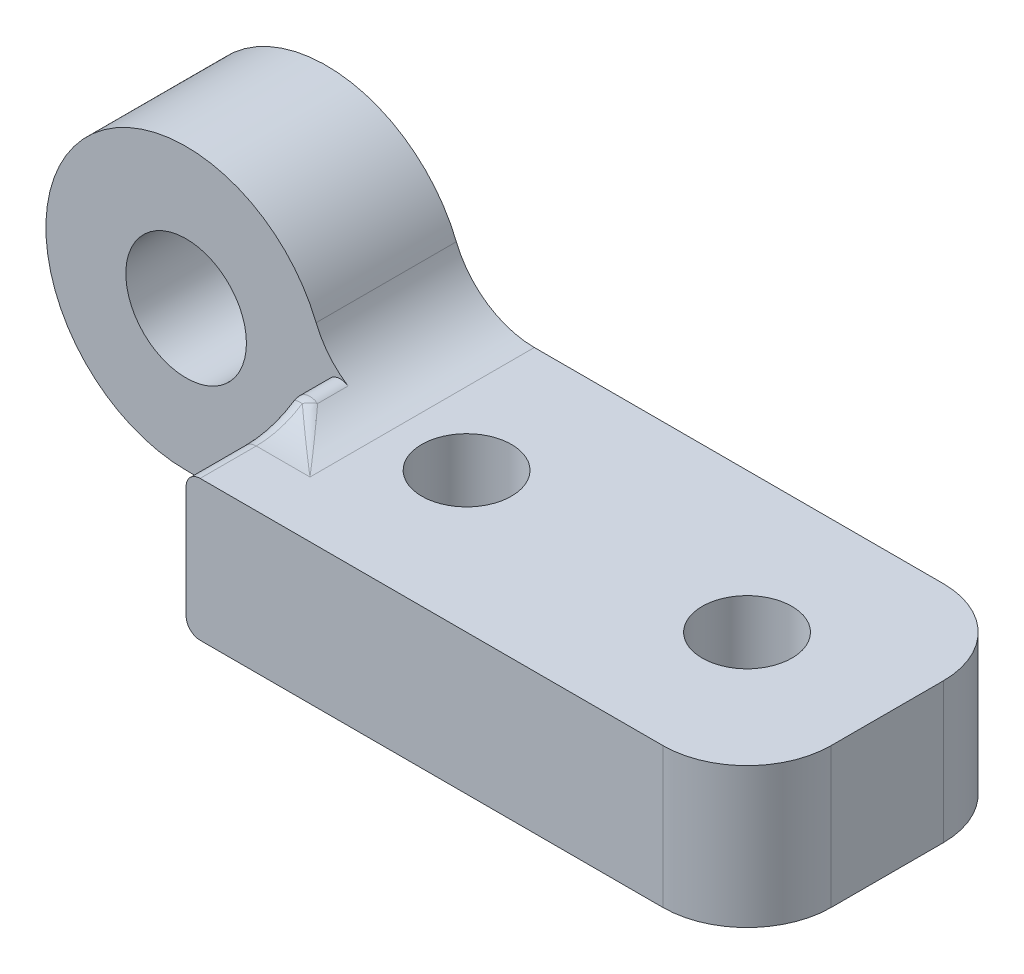
ISO-10303-21;
HEADER;
FILE_DESCRIPTION(('STEP AP214'),'2;1');
FILE_NAME('part.step','',(''),(''),'','','');
FILE_SCHEMA(('AUTOMOTIVE_DESIGN { 1 0 10303 214 1 1 1 1 }'));
ENDSEC;
DATA;
#1=APPLICATION_CONTEXT('core data for automotive mechanical design processes');
#2=APPLICATION_PROTOCOL_DEFINITION('international standard','automotive_design',2000,#1);
#3=PRODUCT_CONTEXT('',#1,'mechanical');
#4=PRODUCT('Part','Part','',(#3));
#5=PRODUCT_RELATED_PRODUCT_CATEGORY('part','',(#4));
#6=PRODUCT_DEFINITION_FORMATION('','',#4);
#7=PRODUCT_DEFINITION_CONTEXT('part definition',#1,'design');
#8=PRODUCT_DEFINITION('design','',#6,#7);
#9=PRODUCT_DEFINITION_SHAPE('','',#8);
#10=(LENGTH_UNIT() NAMED_UNIT(*) SI_UNIT(.MILLI.,.METRE.));
#11=(NAMED_UNIT(*) PLANE_ANGLE_UNIT() SI_UNIT($,.RADIAN.));
#12=(NAMED_UNIT(*) SI_UNIT($,.STERADIAN.) SOLID_ANGLE_UNIT());
#13=UNCERTAINTY_MEASURE_WITH_UNIT(LENGTH_MEASURE(1.E-05),#10,'distance_accuracy_value','');
#14=(GEOMETRIC_REPRESENTATION_CONTEXT(3) GLOBAL_UNCERTAINTY_ASSIGNED_CONTEXT((#13)) GLOBAL_UNIT_ASSIGNED_CONTEXT((#10,
#11,#12)) REPRESENTATION_CONTEXT('',''));
#15=CARTESIAN_POINT('',(0.,0.,0.));
#16=DIRECTION('',(0.,0.,1.));
#17=DIRECTION('',(1.,0.,0.));
#18=AXIS2_PLACEMENT_3D('',#15,#16,#17);
#19=CARTESIAN_POINT('',(0.,0.,-5.));
#20=DIRECTION('',(0.,0.,1.));
#21=DIRECTION('',(1.,0.,0.));
#22=AXIS2_PLACEMENT_3D('',#19,#20,#21);
#23=PLANE('',#22);
#24=CARTESIAN_POINT('',(0.,0.,-5.));
#25=DIRECTION('',(0.,0.,1.));
#26=DIRECTION('',(1.,0.,0.));
#27=AXIS2_PLACEMENT_3D('',#24,#25,#26);
#28=CIRCLE('',#27,2.15);
#29=CARTESIAN_POINT('',(2.15,0.,-5.));
#30=VERTEX_POINT('',#29);
#31=EDGE_CURVE('E157',#30,#30,#28,.T.);
#32=ORIENTED_EDGE('',*,*,#31,.F.);
#33=EDGE_LOOP('',(#32));
#34=FACE_BOUND('',#33,.T.);
#35=DIRECTION('',(0.,-1.,0.));
#36=VECTOR('',#35,1.);
#37=CARTESIAN_POINT('',(5.,0.,-5.));
#38=LINE('',#37,#36);
#39=CARTESIAN_POINT('',(5.,0.0711464089080361,-5.));
#40=VERTEX_POINT('',#39);
#41=CARTESIAN_POINT('',(5.,-4.5,-5.));
#42=VERTEX_POINT('',#41);
#43=EDGE_CURVE('E181',#40,#42,#38,.T.);
#44=ORIENTED_EDGE('',*,*,#43,.F.);
#45=CARTESIAN_POINT('',(5.5,0.0711464089080361,-5.));
#46=DIRECTION('',(0.,0.,1.));
#47=DIRECTION('',(1.,0.,0.));
#48=AXIS2_PLACEMENT_3D('',#45,#46,#47);
#49=CIRCLE('',#48,0.5);
#50=CARTESIAN_POINT('',(5.77374264101367,0.489554064778317,-5.));
#51=VERTEX_POINT('',#50);
#52=EDGE_CURVE('E234',#40,#51,#49,.F.);
#53=ORIENTED_EDGE('',*,*,#52,.T.);
#54=CARTESIAN_POINT('',(7.41619848709566,3.,-5.));
#55=DIRECTION('',(0.,0.,1.));
#56=DIRECTION('',(1.,0.,0.));
#57=AXIS2_PLACEMENT_3D('',#54,#55,#56);
#58=CIRCLE('',#57,3.);
#59=CARTESIAN_POINT('',(4.63512405443479,1.875,-5.));
#60=VERTEX_POINT('',#59);
#61=EDGE_CURVE('E207',#51,#60,#58,.F.);
#62=ORIENTED_EDGE('',*,*,#61,.T.);
#63=CARTESIAN_POINT('',(0.,0.,-5.));
#64=DIRECTION('',(0.,0.,1.));
#65=DIRECTION('',(1.,0.,0.));
#66=AXIS2_PLACEMENT_3D('',#63,#64,#65);
#67=CIRCLE('',#66,5.);
#68=CARTESIAN_POINT('',(0.,-5.,-5.));
#69=VERTEX_POINT('',#68);
#70=EDGE_CURVE('E156',#60,#69,#67,.T.);
#71=ORIENTED_EDGE('',*,*,#70,.T.);
#72=DIRECTION('',(-1.,0.,0.));
#73=VECTOR('',#72,1.);
#74=CARTESIAN_POINT('',(0.,-5.,-5.));
#75=LINE('',#74,#73);
#76=CARTESIAN_POINT('',(5.5,-5.,-5.));
#77=VERTEX_POINT('',#76);
#78=EDGE_CURVE('E173',#77,#69,#75,.T.);
#79=ORIENTED_EDGE('',*,*,#78,.F.);
#80=CARTESIAN_POINT('',(5.5,-4.5,-5.));
#81=DIRECTION('',(0.,0.,1.));
#82=DIRECTION('',(1.,0.,0.));
#83=AXIS2_PLACEMENT_3D('',#80,#81,#82);
#84=CIRCLE('',#83,0.5);
#85=EDGE_CURVE('E231',#77,#42,#84,.F.);
#86=ORIENTED_EDGE('',*,*,#85,.T.);
#87=EDGE_LOOP('',(#44,#53,#62,#71,#79,#86));
#88=FACE_BOUND('',#87,.T.);
#89=ADVANCED_FACE('F43',(#34,#88),#23,.T.);
#90=CARTESIAN_POINT('',(0.,0.,-10.));
#91=DIRECTION('',(0.,0.,1.));
#92=DIRECTION('',(1.,0.,0.));
#93=AXIS2_PLACEMENT_3D('',#90,#91,#92);
#94=PLANE('',#93);
#95=DIRECTION('',(1.,0.,0.));
#96=VECTOR('',#95,1.);
#97=CARTESIAN_POINT('',(0.,0.,-10.));
#98=LINE('',#97,#96);
#99=CARTESIAN_POINT('',(7.41619848709566,0.,-10.));
#100=VERTEX_POINT('',#99);
#101=CARTESIAN_POINT('',(22.,0.,-10.));
#102=VERTEX_POINT('',#101);
#103=EDGE_CURVE('E186',#100,#102,#98,.T.);
#104=ORIENTED_EDGE('',*,*,#103,.T.);
#105=DIRECTION('',(0.,-1.,0.));
#106=VECTOR('',#105,1.);
#107=CARTESIAN_POINT('',(22.,0.,-10.));
#108=LINE('',#107,#106);
#109=CARTESIAN_POINT('',(22.,-5.,-10.));
#110=VERTEX_POINT('',#109);
#111=EDGE_CURVE('E166',#102,#110,#108,.T.);
#112=ORIENTED_EDGE('',*,*,#111,.T.);
#113=DIRECTION('',(1.,0.,0.));
#114=VECTOR('',#113,1.);
#115=CARTESIAN_POINT('',(0.,-5.,-10.));
#116=LINE('',#115,#114);
#117=CARTESIAN_POINT('',(0.,-5.,-10.));
#118=VERTEX_POINT('',#117);
#119=EDGE_CURVE('E161',#118,#110,#116,.T.);
#120=ORIENTED_EDGE('',*,*,#119,.F.);
#121=CARTESIAN_POINT('',(0.,0.,-10.));
#122=DIRECTION('',(0.,0.,1.));
#123=DIRECTION('',(1.,0.,0.));
#124=AXIS2_PLACEMENT_3D('',#121,#122,#123);
#125=CIRCLE('',#124,5.);
#126=CARTESIAN_POINT('',(4.63512405443479,1.875,-10.));
#127=VERTEX_POINT('',#126);
#128=EDGE_CURVE('E145',#127,#118,#125,.T.);
#129=ORIENTED_EDGE('',*,*,#128,.F.);
#130=CARTESIAN_POINT('',(7.41619848709566,3.,-10.));
#131=DIRECTION('',(0.,0.,1.));
#132=DIRECTION('',(1.,0.,0.));
#133=AXIS2_PLACEMENT_3D('',#130,#131,#132);
#134=CIRCLE('',#133,3.);
#135=EDGE_CURVE('E204',#127,#100,#134,.T.);
#136=ORIENTED_EDGE('',*,*,#135,.T.);
#137=EDGE_LOOP('',(#104,#112,#120,#129,#136));
#138=FACE_BOUND('',#137,.T.);
#139=CARTESIAN_POINT('',(0.,0.,-10.));
#140=DIRECTION('',(0.,0.,1.));
#141=DIRECTION('',(1.,0.,0.));
#142=AXIS2_PLACEMENT_3D('',#139,#140,#141);
#143=CIRCLE('',#142,2.15);
#144=CARTESIAN_POINT('',(2.15,0.,-10.));
#145=VERTEX_POINT('',#144);
#146=EDGE_CURVE('E189',#145,#145,#143,.T.);
#147=ORIENTED_EDGE('',*,*,#146,.T.);
#148=EDGE_LOOP('',(#147));
#149=FACE_BOUND('',#148,.T.);
#150=ADVANCED_FACE('F163',(#138,#149),#94,.F.);
#151=CARTESIAN_POINT('',(0.,0.,-5.));
#152=DIRECTION('',(0.,0.,-1.));
#153=DIRECTION('',(-1.,0.,0.));
#154=AXIS2_PLACEMENT_3D('',#151,#152,#153);
#155=CYLINDRICAL_SURFACE('',#154,5.);
#156=ORIENTED_EDGE('',*,*,#70,.F.);
#157=DIRECTION('',(0.,0.,-1.));
#158=VECTOR('',#157,1.);
#159=CARTESIAN_POINT('',(4.63512405443479,1.875,-5.));
#160=LINE('',#159,#158);
#161=EDGE_CURVE('E153',#60,#127,#160,.T.);
#162=ORIENTED_EDGE('',*,*,#161,.T.);
#163=ORIENTED_EDGE('',*,*,#128,.T.);
#164=DIRECTION('',(0.,0.,-1.));
#165=VECTOR('',#164,1.);
#166=CARTESIAN_POINT('',(0.,-5.,0.));
#167=LINE('',#166,#165);
#168=EDGE_CURVE('E150',#69,#118,#167,.T.);
#169=ORIENTED_EDGE('',*,*,#168,.F.);
#170=EDGE_LOOP('',(#156,#162,#163,#169));
#171=FACE_BOUND('',#170,.T.);
#172=ADVANCED_FACE('F148',(#171),#155,.T.);
#173=CARTESIAN_POINT('',(0.,0.,-5.));
#174=DIRECTION('',(0.,0.,-1.));
#175=DIRECTION('',(-1.,0.,0.));
#176=AXIS2_PLACEMENT_3D('',#173,#174,#175);
#177=CYLINDRICAL_SURFACE('',#176,2.15);
#178=ORIENTED_EDGE('',*,*,#146,.F.);
#179=EDGE_LOOP('',(#178));
#180=FACE_BOUND('',#179,.T.);
#181=ORIENTED_EDGE('',*,*,#31,.T.);
#182=EDGE_LOOP('',(#181));
#183=FACE_BOUND('',#182,.T.);
#184=ADVANCED_FACE('F312',(#180,#183),#177,.F.);
#185=CARTESIAN_POINT('',(0.,0.,0.));
#186=DIRECTION('',(0.,1.,0.));
#187=DIRECTION('',(0.,0.,1.));
#188=AXIS2_PLACEMENT_3D('',#185,#186,#187);
#189=PLANE('',#188);
#190=CARTESIAN_POINT('',(20.,0.,-5.));
#191=DIRECTION('',(0.,1.,0.));
#192=DIRECTION('',(0.,0.,1.));
#193=AXIS2_PLACEMENT_3D('',#190,#191,#192);
#194=CIRCLE('',#193,1.6);
#195=CARTESIAN_POINT('',(20.,0.,-3.4));
#196=VERTEX_POINT('',#195);
#197=EDGE_CURVE('E177',#196,#196,#194,.T.);
#198=ORIENTED_EDGE('',*,*,#197,.F.);
#199=EDGE_LOOP('',(#198));
#200=FACE_BOUND('',#199,.T.);
#201=CARTESIAN_POINT('',(10.,0.,-5.));
#202=DIRECTION('',(0.,1.,0.));
#203=DIRECTION('',(0.,0.,1.));
#204=AXIS2_PLACEMENT_3D('',#201,#202,#203);
#205=CIRCLE('',#204,1.6);
#206=CARTESIAN_POINT('',(10.,0.,-3.4));
#207=VERTEX_POINT('',#206);
#208=EDGE_CURVE('E407',#207,#207,#205,.T.);
#209=ORIENTED_EDGE('',*,*,#208,.F.);
#210=EDGE_LOOP('',(#209));
#211=FACE_BOUND('',#210,.T.);
#212=DIRECTION('',(0.,0.,-1.));
#213=VECTOR('',#212,1.);
#214=CARTESIAN_POINT('',(25.,0.,0.));
#215=LINE('',#214,#213);
#216=CARTESIAN_POINT('',(25.,0.,-3.));
#217=VERTEX_POINT('',#216);
#218=CARTESIAN_POINT('',(25.,0.,-7.));
#219=VERTEX_POINT('',#218);
#220=EDGE_CURVE('E392',#217,#219,#215,.T.);
#221=ORIENTED_EDGE('',*,*,#220,.T.);
#222=CARTESIAN_POINT('',(22.,0.,-7.));
#223=DIRECTION('',(0.,1.,0.));
#224=DIRECTION('',(0.,0.,1.));
#225=AXIS2_PLACEMENT_3D('',#222,#223,#224);
#226=CIRCLE('',#225,3.);
#227=EDGE_CURVE('E52',#219,#102,#226,.T.);
#228=ORIENTED_EDGE('',*,*,#227,.T.);
#229=ORIENTED_EDGE('',*,*,#103,.F.);
#230=DIRECTION('',(0.,0.,-1.));
#231=VECTOR('',#230,1.);
#232=CARTESIAN_POINT('',(7.41619848709566,0.,0.));
#233=LINE('',#232,#231);
#234=CARTESIAN_POINT('',(7.41619848709566,0.,-2.));
#235=VERTEX_POINT('',#234);
#236=EDGE_CURVE('E200',#100,#235,#233,.F.);
#237=ORIENTED_EDGE('',*,*,#236,.T.);
#238=DIRECTION('',(-1.,0.,0.));
#239=VECTOR('',#238,1.);
#240=CARTESIAN_POINT('',(5.,0.,-2.));
#241=LINE('',#240,#239);
#242=CARTESIAN_POINT('',(5.5,0.,-2.));
#243=VERTEX_POINT('',#242);
#244=EDGE_CURVE('E210',#235,#243,#241,.T.);
#245=ORIENTED_EDGE('',*,*,#244,.T.);
#246=DIRECTION('',(0.,0.,-1.));
#247=VECTOR('',#246,1.);
#248=CARTESIAN_POINT('',(5.5,0.,0.));
#249=LINE('',#248,#247);
#250=CARTESIAN_POINT('',(5.5,0.,0.));
#251=VERTEX_POINT('',#250);
#252=EDGE_CURVE('E257',#243,#251,#249,.F.);
#253=ORIENTED_EDGE('',*,*,#252,.T.);
#254=DIRECTION('',(1.,0.,0.));
#255=VECTOR('',#254,1.);
#256=CARTESIAN_POINT('',(0.,0.,0.));
#257=LINE('',#256,#255);
#258=CARTESIAN_POINT('',(22.,0.,0.));
#259=VERTEX_POINT('',#258);
#260=EDGE_CURVE('E404',#251,#259,#257,.T.);
#261=ORIENTED_EDGE('',*,*,#260,.T.);
#262=CARTESIAN_POINT('',(22.,0.,-3.));
#263=DIRECTION('',(0.,1.,0.));
#264=DIRECTION('',(0.,0.,1.));
#265=AXIS2_PLACEMENT_3D('',#262,#263,#264);
#266=CIRCLE('',#265,3.);
#267=EDGE_CURVE('E381',#259,#217,#266,.T.);
#268=ORIENTED_EDGE('',*,*,#267,.T.);
#269=EDGE_LOOP('',(#221,#228,#229,#237,#245,#253,#261,#268));
#270=FACE_BOUND('',#269,.T.);
#271=ADVANCED_FACE('F318',(#200,#211,#270),#189,.T.);
#272=CARTESIAN_POINT('',(5.,0.,0.));
#273=DIRECTION('',(-1.,0.,0.));
#274=DIRECTION('',(0.,0.,1.));
#275=AXIS2_PLACEMENT_3D('',#272,#273,#274);
#276=PLANE('',#275);
#277=DIRECTION('',(0.,0.,-1.));
#278=VECTOR('',#277,1.);
#279=CARTESIAN_POINT('',(5.,-0.5,0.));
#280=LINE('',#279,#278);
#281=CARTESIAN_POINT('',(5.,-0.5,0.));
#282=VERTEX_POINT('',#281);
#283=CARTESIAN_POINT('',(5.,-0.5,-2.));
#284=VERTEX_POINT('',#283);
#285=EDGE_CURVE('E251',#282,#284,#280,.T.);
#286=ORIENTED_EDGE('',*,*,#285,.T.);
#287=CARTESIAN_POINT('',(5.,3.,-2.));
#288=DIRECTION('',(-1.,0.,0.));
#289=DIRECTION('',(0.,0.,1.));
#290=AXIS2_PLACEMENT_3D('',#287,#288,#289);
#291=CIRCLE('',#290,3.5);
#292=CARTESIAN_POINT('',(5.,0.0711464089080361,-3.91619848709566));
#293=VERTEX_POINT('',#292);
#294=EDGE_CURVE('E254',#284,#293,#291,.F.);
#295=ORIENTED_EDGE('',*,*,#294,.T.);
#296=DIRECTION('',(0.,0.,1.));
#297=VECTOR('',#296,1.);
#298=CARTESIAN_POINT('',(5.,0.0711464089080361,-5.));
#299=LINE('',#298,#297);
#300=EDGE_CURVE('E217',#293,#40,#299,.F.);
#301=ORIENTED_EDGE('',*,*,#300,.T.);
#302=ORIENTED_EDGE('',*,*,#43,.T.);
#303=DIRECTION('',(0.,0.,-1.));
#304=VECTOR('',#303,1.);
#305=CARTESIAN_POINT('',(5.,-4.5,0.));
#306=LINE('',#305,#304);
#307=CARTESIAN_POINT('',(5.,-4.5,0.));
#308=VERTEX_POINT('',#307);
#309=EDGE_CURVE('E220',#42,#308,#306,.F.);
#310=ORIENTED_EDGE('',*,*,#309,.T.);
#311=DIRECTION('',(0.,-1.,0.));
#312=VECTOR('',#311,1.);
#313=CARTESIAN_POINT('',(5.,0.,0.));
#314=LINE('',#313,#312);
#315=EDGE_CURVE('E185',#282,#308,#314,.T.);
#316=ORIENTED_EDGE('',*,*,#315,.F.);
#317=EDGE_LOOP('',(#286,#295,#301,#302,#310,#316));
#318=FACE_BOUND('',#317,.T.);
#319=ADVANCED_FACE('F323',(#318),#276,.T.);
#320=CARTESIAN_POINT('',(0.,0.,0.));
#321=DIRECTION('',(0.,0.,-1.));
#322=DIRECTION('',(-1.,0.,0.));
#323=AXIS2_PLACEMENT_3D('',#320,#321,#322);
#324=PLANE('',#323);
#325=DIRECTION('',(1.,0.,0.));
#326=VECTOR('',#325,1.);
#327=CARTESIAN_POINT('',(0.,-5.,0.));
#328=LINE('',#327,#326);
#329=CARTESIAN_POINT('',(5.5,-5.,0.));
#330=VERTEX_POINT('',#329);
#331=CARTESIAN_POINT('',(22.,-5.,0.));
#332=VERTEX_POINT('',#331);
#333=EDGE_CURVE('E365',#330,#332,#328,.T.);
#334=ORIENTED_EDGE('',*,*,#333,.T.);
#335=DIRECTION('',(0.,-1.,0.));
#336=VECTOR('',#335,1.);
#337=CARTESIAN_POINT('',(22.,0.,0.));
#338=LINE('',#337,#336);
#339=EDGE_CURVE('E11',#332,#259,#338,.F.);
#340=ORIENTED_EDGE('',*,*,#339,.T.);
#341=ORIENTED_EDGE('',*,*,#260,.F.);
#342=CARTESIAN_POINT('',(5.5,-0.5,0.));
#343=DIRECTION('',(0.,0.,-1.));
#344=DIRECTION('',(-1.,0.,0.));
#345=AXIS2_PLACEMENT_3D('',#342,#343,#344);
#346=CIRCLE('',#345,0.5);
#347=EDGE_CURVE('E260',#251,#282,#346,.F.);
#348=ORIENTED_EDGE('',*,*,#347,.T.);
#349=ORIENTED_EDGE('',*,*,#315,.T.);
#350=CARTESIAN_POINT('',(5.5,-4.5,0.));
#351=DIRECTION('',(0.,0.,-1.));
#352=DIRECTION('',(-1.,0.,0.));
#353=AXIS2_PLACEMENT_3D('',#350,#351,#352);
#354=CIRCLE('',#353,0.5);
#355=EDGE_CURVE('E224',#308,#330,#354,.F.);
#356=ORIENTED_EDGE('',*,*,#355,.T.);
#357=EDGE_LOOP('',(#334,#340,#341,#348,#349,#356));
#358=FACE_BOUND('',#357,.T.);
#359=ADVANCED_FACE('F331',(#358),#324,.F.);
#360=CARTESIAN_POINT('',(25.,0.,0.));
#361=DIRECTION('',(-1.,0.,0.));
#362=DIRECTION('',(0.,0.,1.));
#363=AXIS2_PLACEMENT_3D('',#360,#361,#362);
#364=PLANE('',#363);
#365=DIRECTION('',(0.,0.,-1.));
#366=VECTOR('',#365,1.);
#367=CARTESIAN_POINT('',(25.,-5.,0.));
#368=LINE('',#367,#366);
#369=CARTESIAN_POINT('',(25.,-5.,-3.));
#370=VERTEX_POINT('',#369);
#371=CARTESIAN_POINT('',(25.,-5.,-7.));
#372=VERTEX_POINT('',#371);
#373=EDGE_CURVE('E169',#370,#372,#368,.T.);
#374=ORIENTED_EDGE('',*,*,#373,.T.);
#375=DIRECTION('',(0.,-1.,0.));
#376=VECTOR('',#375,1.);
#377=CARTESIAN_POINT('',(25.,0.,-7.));
#378=LINE('',#377,#376);
#379=EDGE_CURVE('E65',#372,#219,#378,.F.);
#380=ORIENTED_EDGE('',*,*,#379,.T.);
#381=ORIENTED_EDGE('',*,*,#220,.F.);
#382=DIRECTION('',(0.,-1.,0.));
#383=VECTOR('',#382,1.);
#384=CARTESIAN_POINT('',(25.,0.,-3.));
#385=LINE('',#384,#383);
#386=EDGE_CURVE('E376',#217,#370,#385,.T.);
#387=ORIENTED_EDGE('',*,*,#386,.T.);
#388=EDGE_LOOP('',(#374,#380,#381,#387));
#389=FACE_BOUND('',#388,.T.);
#390=ADVANCED_FACE('F341',(#389),#364,.F.);
#391=CARTESIAN_POINT('',(10.,0.,-5.));
#392=DIRECTION('',(0.,-1.,0.));
#393=DIRECTION('',(0.,0.,-1.));
#394=AXIS2_PLACEMENT_3D('',#391,#392,#393);
#395=CYLINDRICAL_SURFACE('',#394,1.6);
#396=ORIENTED_EDGE('',*,*,#208,.T.);
#397=EDGE_LOOP('',(#396));
#398=FACE_BOUND('',#397,.T.);
#399=CARTESIAN_POINT('',(10.,-5.,-5.));
#400=DIRECTION('',(0.,1.,0.));
#401=DIRECTION('',(0.,0.,1.));
#402=AXIS2_PLACEMENT_3D('',#399,#400,#401);
#403=CIRCLE('',#402,1.6);
#404=CARTESIAN_POINT('',(10.,-5.,-3.4));
#405=VERTEX_POINT('',#404);
#406=EDGE_CURVE('E359',#405,#405,#403,.T.);
#407=ORIENTED_EDGE('',*,*,#406,.F.);
#408=EDGE_LOOP('',(#407));
#409=FACE_BOUND('',#408,.T.);
#410=ADVANCED_FACE('F344',(#398,#409),#395,.F.);
#411=CARTESIAN_POINT('',(20.,0.,-5.));
#412=DIRECTION('',(0.,-1.,0.));
#413=DIRECTION('',(0.,0.,-1.));
#414=AXIS2_PLACEMENT_3D('',#411,#412,#413);
#415=CYLINDRICAL_SURFACE('',#414,1.6);
#416=ORIENTED_EDGE('',*,*,#197,.T.);
#417=EDGE_LOOP('',(#416));
#418=FACE_BOUND('',#417,.T.);
#419=CARTESIAN_POINT('',(20.,-5.,-5.));
#420=DIRECTION('',(0.,1.,0.));
#421=DIRECTION('',(0.,0.,1.));
#422=AXIS2_PLACEMENT_3D('',#419,#420,#421);
#423=CIRCLE('',#422,1.6);
#424=CARTESIAN_POINT('',(20.,-5.,-3.4));
#425=VERTEX_POINT('',#424);
#426=EDGE_CURVE('E357',#425,#425,#423,.T.);
#427=ORIENTED_EDGE('',*,*,#426,.F.);
#428=EDGE_LOOP('',(#427));
#429=FACE_BOUND('',#428,.T.);
#430=ADVANCED_FACE('F339',(#418,#429),#415,.F.);
#431=CARTESIAN_POINT('',(0.,-5.,0.));
#432=DIRECTION('',(0.,1.,0.));
#433=DIRECTION('',(0.,0.,1.));
#434=AXIS2_PLACEMENT_3D('',#431,#432,#433);
#435=PLANE('',#434);
#436=ORIENTED_EDGE('',*,*,#426,.T.);
#437=EDGE_LOOP('',(#436));
#438=FACE_BOUND('',#437,.T.);
#439=ORIENTED_EDGE('',*,*,#406,.T.);
#440=EDGE_LOOP('',(#439));
#441=FACE_BOUND('',#440,.T.);
#442=ORIENTED_EDGE('',*,*,#119,.T.);
#443=CARTESIAN_POINT('',(22.,-5.,-7.));
#444=DIRECTION('',(0.,1.,0.));
#445=DIRECTION('',(0.,0.,1.));
#446=AXIS2_PLACEMENT_3D('',#443,#444,#445);
#447=CIRCLE('',#446,3.);
#448=EDGE_CURVE('E379',#110,#372,#447,.F.);
#449=ORIENTED_EDGE('',*,*,#448,.T.);
#450=ORIENTED_EDGE('',*,*,#373,.F.);
#451=CARTESIAN_POINT('',(22.,-5.,-3.));
#452=DIRECTION('',(0.,1.,0.));
#453=DIRECTION('',(0.,0.,1.));
#454=AXIS2_PLACEMENT_3D('',#451,#452,#453);
#455=CIRCLE('',#454,3.);
#456=EDGE_CURVE('E395',#370,#332,#455,.F.);
#457=ORIENTED_EDGE('',*,*,#456,.T.);
#458=ORIENTED_EDGE('',*,*,#333,.F.);
#459=DIRECTION('',(0.,0.,-1.));
#460=VECTOR('',#459,1.);
#461=CARTESIAN_POINT('',(5.5,-5.,-5.));
#462=LINE('',#461,#460);
#463=EDGE_CURVE('E214',#330,#77,#462,.T.);
#464=ORIENTED_EDGE('',*,*,#463,.T.);
#465=ORIENTED_EDGE('',*,*,#78,.T.);
#466=ORIENTED_EDGE('',*,*,#168,.T.);
#467=EDGE_LOOP('',(#442,#449,#450,#457,#458,#464,#465,#466));
#468=FACE_BOUND('',#467,.T.);
#469=ADVANCED_FACE('F171',(#438,#441,#468),#435,.F.);
#470=CARTESIAN_POINT('',(7.41619848709566,3.,-5.));
#471=DIRECTION('',(0.,0.,-1.));
#472=DIRECTION('',(-1.,0.,0.));
#473=AXIS2_PLACEMENT_3D('',#470,#471,#472);
#474=CYLINDRICAL_SURFACE('',#473,3.);
#475=DIRECTION('',(0.,0.,-1.));
#476=VECTOR('',#475,1.);
#477=CARTESIAN_POINT('',(5.77374264101367,0.489554064778317,-5.));
#478=LINE('',#477,#476);
#479=CARTESIAN_POINT('',(5.77374264101367,0.489554064778317,-3.91619848709566));
#480=VERTEX_POINT('',#479);
#481=EDGE_CURVE('E227',#51,#480,#478,.F.);
#482=ORIENTED_EDGE('',*,*,#481,.T.);
#483=CARTESIAN_POINT('',(7.41619848709566,3.,-2.));
#484=DIRECTION('',(-0.759256602365296,0.,0.650791373455968));
#485=DIRECTION('',(-0.650791373455969,0.,-0.759256602365297));
#486=AXIS2_PLACEMENT_3D('',#483,#484,#485);
#487=ELLIPSE('',#486,4.60977222864644,3.);
#488=EDGE_CURVE('E238',#480,#235,#487,.T.);
#489=ORIENTED_EDGE('',*,*,#488,.T.);
#490=ORIENTED_EDGE('',*,*,#236,.F.);
#491=ORIENTED_EDGE('',*,*,#135,.F.);
#492=ORIENTED_EDGE('',*,*,#161,.F.);
#493=ORIENTED_EDGE('',*,*,#61,.F.);
#494=EDGE_LOOP('',(#482,#489,#490,#491,#492,#493));
#495=FACE_BOUND('',#494,.T.);
#496=ADVANCED_FACE('F286',(#495),#474,.F.);
#497=CARTESIAN_POINT('',(0.,3.,-2.));
#498=DIRECTION('',(1.,0.,0.));
#499=DIRECTION('',(0.,0.,-1.));
#500=AXIS2_PLACEMENT_3D('',#497,#498,#499);
#501=CYLINDRICAL_SURFACE('',#500,3.);
#502=ORIENTED_EDGE('',*,*,#244,.F.);
#503=CARTESIAN_POINT('',(7.41619848709566,3.,-2.));
#504=DIRECTION('',(-0.650791373455968,0.,0.759256602365296));
#505=DIRECTION('',(-0.759256602365297,0.,-0.650791373455968));
#506=AXIS2_PLACEMENT_3D('',#503,#504,#505);
#507=ELLIPSE('',#506,4.60977222864644,3.);
#508=CARTESIAN_POINT('',(5.5,0.489554064778317,-3.642455846082));
#509=VERTEX_POINT('',#508);
#510=EDGE_CURVE('E245',#235,#509,#507,.F.);
#511=ORIENTED_EDGE('',*,*,#510,.T.);
#512=CARTESIAN_POINT('',(5.5,3.,-2.));
#513=DIRECTION('',(-1.,0.,0.));
#514=DIRECTION('',(0.,0.,1.));
#515=AXIS2_PLACEMENT_3D('',#512,#513,#514);
#516=CIRCLE('',#515,3.);
#517=EDGE_CURVE('E242',#509,#243,#516,.T.);
#518=ORIENTED_EDGE('',*,*,#517,.T.);
#519=EDGE_LOOP('',(#502,#511,#518));
#520=FACE_BOUND('',#519,.T.);
#521=ADVANCED_FACE('F289',(#520),#501,.F.);
#522=CARTESIAN_POINT('',(5.5,-4.5,0.));
#523=DIRECTION('',(0.,0.,1.));
#524=DIRECTION('',(1.,0.,0.));
#525=AXIS2_PLACEMENT_3D('',#522,#523,#524);
#526=CYLINDRICAL_SURFACE('',#525,0.5);
#527=ORIENTED_EDGE('',*,*,#355,.F.);
#528=ORIENTED_EDGE('',*,*,#309,.F.);
#529=ORIENTED_EDGE('',*,*,#85,.F.);
#530=ORIENTED_EDGE('',*,*,#463,.F.);
#531=EDGE_LOOP('',(#527,#528,#529,#530));
#532=FACE_BOUND('',#531,.T.);
#533=ADVANCED_FACE('F292',(#532),#526,.T.);
#534=CARTESIAN_POINT('',(5.5,0.0711464089080361,-5.));
#535=DIRECTION('',(0.,0.,-1.));
#536=DIRECTION('',(-1.,0.,0.));
#537=AXIS2_PLACEMENT_3D('',#534,#535,#536);
#538=CYLINDRICAL_SURFACE('',#537,0.5);
#539=ORIENTED_EDGE('',*,*,#300,.F.);
#540=CARTESIAN_POINT('',(5.5,0.0711464089080361,-3.91619848709566));
#541=DIRECTION('',(0.,0.,-1.));
#542=DIRECTION('',(-1.,0.,0.));
#543=AXIS2_PLACEMENT_3D('',#540,#541,#542);
#544=CIRCLE('',#543,0.5);
#545=EDGE_CURVE('E248',#293,#480,#544,.T.);
#546=ORIENTED_EDGE('',*,*,#545,.T.);
#547=ORIENTED_EDGE('',*,*,#481,.F.);
#548=ORIENTED_EDGE('',*,*,#52,.F.);
#549=EDGE_LOOP('',(#539,#546,#547,#548));
#550=FACE_BOUND('',#549,.T.);
#551=ADVANCED_FACE('F283',(#550),#538,.T.);
#552=CARTESIAN_POINT('',(5.5,-0.5,0.));
#553=DIRECTION('',(0.,0.,-1.));
#554=DIRECTION('',(-1.,0.,0.));
#555=AXIS2_PLACEMENT_3D('',#552,#553,#554);
#556=CYLINDRICAL_SURFACE('',#555,0.5);
#557=ORIENTED_EDGE('',*,*,#347,.F.);
#558=ORIENTED_EDGE('',*,*,#252,.F.);
#559=CARTESIAN_POINT('',(5.5,-0.5,-2.));
#560=DIRECTION('',(0.,0.,-1.));
#561=DIRECTION('',(-1.,0.,0.));
#562=AXIS2_PLACEMENT_3D('',#559,#560,#561);
#563=CIRCLE('',#562,0.5);
#564=EDGE_CURVE('E360',#284,#243,#563,.T.);
#565=ORIENTED_EDGE('',*,*,#564,.F.);
#566=ORIENTED_EDGE('',*,*,#285,.F.);
#567=EDGE_LOOP('',(#557,#558,#565,#566));
#568=FACE_BOUND('',#567,.T.);
#569=ADVANCED_FACE('F299',(#568),#556,.T.);
#570=CARTESIAN_POINT('',(5.5,3.,-2.));
#571=DIRECTION('',(-1.,0.,0.));
#572=DIRECTION('',(0.,0.,1.));
#573=AXIS2_PLACEMENT_3D('',#570,#571,#572);
#574=TOROIDAL_SURFACE('',#573,3.5,0.5);
#575=CARTESIAN_POINT('',(5.5,0.0711464089080361,-3.91619848709566));
#576=DIRECTION('',(0.,0.547485282027332,-0.836815311740561));
#577=DIRECTION('',(0.,0.836815311740561,0.547485282027332));
#578=AXIS2_PLACEMENT_3D('',#575,#576,#577);
#579=CIRCLE('',#578,0.5);
#580=EDGE_CURVE('E267',#293,#509,#579,.T.);
#581=ORIENTED_EDGE('',*,*,#580,.F.);
#582=ORIENTED_EDGE('',*,*,#294,.F.);
#583=ORIENTED_EDGE('',*,*,#564,.T.);
#584=ORIENTED_EDGE('',*,*,#517,.F.);
#585=EDGE_LOOP('',(#581,#582,#583,#584));
#586=FACE_BOUND('',#585,.T.);
#587=ADVANCED_FACE('F437',(#586),#574,.T.);
#588=CARTESIAN_POINT('',(5.5,0.0711464089080361,-3.91619848709566));
#589=DIRECTION('',(0.,-0.836815311740561,-0.547485282027332));
#590=DIRECTION('',(0.,0.547485282027332,-0.836815311740561));
#591=AXIS2_PLACEMENT_3D('',#588,#589,#590);
#592=SPHERICAL_SURFACE('',#591,0.5);
#593=ORIENTED_EDGE('',*,*,#545,.F.);
#594=ORIENTED_EDGE('',*,*,#580,.T.);
#595=CARTESIAN_POINT('',(5.5,0.0711464089080361,-3.91619848709566));
#596=DIRECTION('',(0.641758997722446,-0.419869953300499,0.641758997722446));
#597=DIRECTION('',(0.707106781186548,0.,-0.707106781186548));
#598=AXIS2_PLACEMENT_3D('',#595,#596,#597);
#599=CIRCLE('',#598,0.5);
#600=EDGE_CURVE('E263',#480,#509,#599,.T.);
#601=ORIENTED_EDGE('',*,*,#600,.F.);
#602=EDGE_LOOP('',(#593,#594,#601));
#603=FACE_BOUND('',#602,.T.);
#604=ADVANCED_FACE('F281',(#603),#592,.T.);
#605=CARTESIAN_POINT('',(7.41619848709566,0.,-2.));
#606=CARTESIAN_POINT('',(7.41619848709566,0.,-2.));
#607=CARTESIAN_POINT('',(7.41619848709566,0.,-2.));
#608=CARTESIAN_POINT('',(7.28550424578428,5.25828750215514E-05,-2.15247661486328));
#609=CARTESIAN_POINT('',(7.27458505671294,-0.000151376025948165,-2.14161343038272));
#610=CARTESIAN_POINT('',(7.26372187223238,5.25828750218087E-05,-2.13069424131139));
#611=CARTESIAN_POINT('',(7.15477663372318,0.00854473114625228,-2.3049921622679));
#612=CARTESIAN_POINT('',(7.13258155227031,0.00997503571551679,-2.28361693482535));
#613=CARTESIAN_POINT('',(7.11120632482776,0.00854473114625243,-2.26142185337249));
#614=CARTESIAN_POINT('',(6.89556950528711,0.0426405766333478,-2.60740047877664));
#615=CARTESIAN_POINT('',(6.85235465957821,0.0498173293049179,-2.56384382751745));
#616=CARTESIAN_POINT('',(6.80879800831902,0.0426405766333477,-2.52062898180855));
#617=CARTESIAN_POINT('',(6.76708032517155,0.0680982139827124,-2.7573045222448));
#618=CARTESIAN_POINT('',(6.71332798081166,0.0795902223508044,-2.70287050628401));
#619=CARTESIAN_POINT('',(6.65889396485087,0.068098213982712,-2.64911816192411));
#620=CARTESIAN_POINT('',(6.5145382292011,0.135774462834436,-3.05193696754366));
#621=CARTESIAN_POINT('',(6.44199559859457,0.158106749972941,-2.97420288850109));
#622=CARTESIAN_POINT('',(6.364261519552,0.135774462834436,-2.90166025789456));
#623=CARTESIAN_POINT('',(6.39044705220598,0.177704781233262,-3.19671000737129));
#624=CARTESIAN_POINT('',(6.30889671006469,0.206962348451663,-3.10730177703097));
#625=CARTESIAN_POINT('',(6.21948847972437,0.177704781233262,-3.02575143488968));
#626=CARTESIAN_POINT('',(6.14886208613561,0.277770128539701,-3.4785591344534));
#627=CARTESIAN_POINT('',(6.05224297367665,0.322275291488321,-3.36395551341901));
#628=CARTESIAN_POINT('',(5.93763935264227,0.277770128539701,-3.26733640096005));
#629=CARTESIAN_POINT('',(6.0312810795557,0.335480518671521,-3.61573697546329));
#630=CARTESIAN_POINT('',(5.92792134679666,0.38889633216245,-3.488277140299));
#631=CARTESIAN_POINT('',(5.80046151163237,0.335480518671521,-3.38491740753997));
#632=CARTESIAN_POINT('',(5.80477898107581,0.466252164995585,-3.87998942368982));
#633=CARTESIAN_POINT('',(5.69146419378101,0.537866352281824,-3.72473429331465));
#634=CARTESIAN_POINT('',(5.53620906340584,0.466252164995585,-3.61141950601985));
#635=CARTESIAN_POINT('',(5.69570137108227,0.538766332659325,-4.00724663534895));
#636=CARTESIAN_POINT('',(5.57860962586865,0.620418448549264,-3.83758886122701));
#637=CARTESIAN_POINT('',(5.40895185174671,0.538766332659325,-3.72049711601339));
#638=CARTESIAN_POINT('',(5.48814625715926,0.698029552184917,-4.24939426825914));
#639=CARTESIAN_POINT('',(5.36742700120154,0.798751281045105,-4.04877148589413));
#640=CARTESIAN_POINT('',(5.16680421883652,0.698029552184917,-3.92805222993641));
#641=CARTESIAN_POINT('',(5.38942347221876,0.784133095733687,-4.36457085068972));
#642=CARTESIAN_POINT('',(5.26845879845508,0.894747789261256,-4.14773968864058));
#643=CARTESIAN_POINT('',(5.05162763640594,0.784133095733687,-4.0267750148769));
#644=CARTESIAN_POINT('',(5.20436064626929,0.969198333244189,-4.5804774809641));
#645=CARTESIAN_POINT('',(5.0869080241593,1.0968523632921,-4.32929046293636));
#646=CARTESIAN_POINT('',(4.83572100613156,0.969198333244189,-4.21183784082637));
#647=CARTESIAN_POINT('',(5.11767225011169,1.0674559699243,-4.68161394314796));
#648=CARTESIAN_POINT('',(5.00380179768804,1.20313886003774,-4.41239668940762));
#649=CARTESIAN_POINT('',(4.7345845439477,1.0674559699243,-4.29852623698397));
#650=CARTESIAN_POINT('',(4.95826946710203,1.27519928755193,-4.86758385665923));
#651=CARTESIAN_POINT('',(4.85509551094547,1.42218193192738,-4.5611029761502));
#652=CARTESIAN_POINT('',(4.54861463043643,1.27519928755193,-4.45792901999363));
#653=CARTESIAN_POINT('',(4.88510211469233,1.38398177718542,-4.95294576780389));
#654=CARTESIAN_POINT('',(4.78912435224046,1.53500073379482,-4.62707413485521));
#655=CARTESIAN_POINT('',(4.46325271929177,1.38398177718542,-4.53109637240334));
#656=CARTESIAN_POINT('',(4.75410054279646,1.61089437947796,-5.10578093501574));
#657=CARTESIAN_POINT('',(4.67476840686936,1.76329579965834,-4.7414300802263));
#658=CARTESIAN_POINT('',(4.31041755207992,1.61089437947796,-4.66209794429921));
#659=CARTESIAN_POINT('',(4.69573185962925,1.72839948556269,-5.17387773204415));
#660=CARTESIAN_POINT('',(4.62618429710759,1.87861481639007,-4.79001418998807));
#661=CARTESIAN_POINT('',(4.24232075505151,1.72839948556269,-4.72046662746641));
#662=CARTESIAN_POINT('',(4.59540269582879,1.9706354201369,-5.29092842314468));
#663=CARTESIAN_POINT('',(4.54545336990749,2.10867896913421,-4.87074511718818));
#664=CARTESIAN_POINT('',(4.12527006395098,1.9706354201369,-4.82079579126687));
#665=CARTESIAN_POINT('',(4.55288666417602,2.09489959563138,-5.34053046007291));
#666=CARTESIAN_POINT('',(4.51326270223758,2.22294574762998,-4.90293578485808));
#667=CARTESIAN_POINT('',(4.07566802702275,2.09489959563138,-4.86331182291964));
#668=CARTESIAN_POINT('',(4.48499023475555,2.34832342866421,-5.41974296106346));
#669=CARTESIAN_POINT('',(4.46318732863912,2.44932834978406,-4.95301115845654));
#670=CARTESIAN_POINT('',(3.9964555260322,2.34832342866421,-4.93120825234011));
#671=CARTESIAN_POINT('',(4.45913364616585,2.47722405678066,-5.44990898108477));
#672=CARTESIAN_POINT('',(4.44535331456859,2.56059684268803,-4.97084517252707));
#673=CARTESIAN_POINT('',(3.96628950601089,2.47722405678066,-4.95706484092981));
#674=CARTESIAN_POINT('',(4.42487749761734,2.73746628668279,-5.48987448772471));
#675=CARTESIAN_POINT('',(4.42182981554308,2.78180014338832,-4.99436867155258));
#676=CARTESIAN_POINT('',(3.92632399937096,2.73746628668279,-4.99132098947832));
#677=CARTESIAN_POINT('',(4.41619848709566,2.8687331433414,-5.5));
#678=CARTESIAN_POINT('',(4.41619848709566,2.89058170766133,-5.));
#679=CARTESIAN_POINT('',(3.91619848709566,2.8687331433414,-5.));
#680=CARTESIAN_POINT('',(4.41619848709566,3.1312668566586,-5.5));
#681=CARTESIAN_POINT('',(4.41619848709566,3.10941829233867,-5.));
#682=CARTESIAN_POINT('',(3.91619848709566,3.1312668566586,-5.));
#683=CARTESIAN_POINT('',(4.42487749761734,3.26253371331721,-5.48987448772471));
#684=CARTESIAN_POINT('',(4.42182981554308,3.21819985661168,-4.99436867155258));
#685=CARTESIAN_POINT('',(3.92632399937096,3.26253371331721,-4.99132098947832));
#686=CARTESIAN_POINT('',(4.45913364616585,3.52277594321934,-5.44990898108477));
#687=CARTESIAN_POINT('',(4.44535331456859,3.43940315731197,-4.97084517252707));
#688=CARTESIAN_POINT('',(3.96628950601089,3.52277594321934,-4.95706484092981));
#689=CARTESIAN_POINT('',(4.48499023475555,3.65167657133578,-5.41974296106346));
#690=CARTESIAN_POINT('',(4.46318732863912,3.55067165021594,-4.95301115845654));
#691=CARTESIAN_POINT('',(3.9964555260322,3.65167657133578,-4.93120825234011));
#692=CARTESIAN_POINT('',(4.55288666417602,3.90510040436862,-5.34053046007291));
#693=CARTESIAN_POINT('',(4.51326270223758,3.77705425237002,-4.90293578485808));
#694=CARTESIAN_POINT('',(4.07566802702275,3.90510040436862,-4.86331182291964));
#695=CARTESIAN_POINT('',(4.59540269582879,4.0293645798631,-5.29092842314468));
#696=CARTESIAN_POINT('',(4.54545336990749,3.89132103086579,-4.87074511718818));
#697=CARTESIAN_POINT('',(4.12527006395098,4.0293645798631,-4.82079579126687));
#698=CARTESIAN_POINT('',(4.69573185962925,4.27160051443731,-5.17387773204415));
#699=CARTESIAN_POINT('',(4.62618429710759,4.12138518360993,-4.79001418998807));
#700=CARTESIAN_POINT('',(4.24232075505151,4.27160051443731,-4.72046662746642));
#701=CARTESIAN_POINT('',(4.75410054279645,4.38910562052204,-5.10578093501574));
#702=CARTESIAN_POINT('',(4.67476840686936,4.23670420034165,-4.7414300802263));
#703=CARTESIAN_POINT('',(4.31041755207992,4.38910562052204,-4.66209794429921));
#704=CARTESIAN_POINT('',(4.88510211469233,4.61601822281457,-4.95294576780389));
#705=CARTESIAN_POINT('',(4.78912435224046,4.46499926620518,-4.62707413485521));
#706=CARTESIAN_POINT('',(4.46325271929177,4.61601822281457,-4.53109637240334));
#707=CARTESIAN_POINT('',(4.95826946710203,4.72480071244807,-4.86758385665924));
#708=CARTESIAN_POINT('',(4.85509551094547,4.57781806807262,-4.5611029761502));
#709=CARTESIAN_POINT('',(4.54861463043643,4.72480071244807,-4.45792901999363));
#710=CARTESIAN_POINT('',(5.11767225011169,4.9325440300757,-4.68161394314797));
#711=CARTESIAN_POINT('',(5.00380179768804,4.79686113996225,-4.41239668940762));
#712=CARTESIAN_POINT('',(4.7345845439477,4.9325440300757,-4.29852623698397));
#713=CARTESIAN_POINT('',(5.20436064626929,5.03080166675581,-4.5804774809641));
#714=CARTESIAN_POINT('',(5.0869080241593,4.9031476367079,-4.32929046293636));
#715=CARTESIAN_POINT('',(4.83572100613156,5.03080166675581,-4.21183784082637));
#716=CARTESIAN_POINT('',(5.38942347221876,5.21586690426631,-4.36457085068972));
#717=CARTESIAN_POINT('',(5.26845879845508,5.10525221073874,-4.14773968864058));
#718=CARTESIAN_POINT('',(5.05162763640594,5.21586690426631,-4.02677501487691));
#719=CARTESIAN_POINT('',(5.48814625715926,5.30197044781508,-4.24939426825914));
#720=CARTESIAN_POINT('',(5.36742700120153,5.20124871895489,-4.04877148589413));
#721=CARTESIAN_POINT('',(5.16680421883652,5.30197044781508,-3.92805222993641));
#722=CARTESIAN_POINT('',(5.69570137108227,5.46123366734067,-4.00724663534896));
#723=CARTESIAN_POINT('',(5.57860962586865,5.37958155145073,-3.83758886122701));
#724=CARTESIAN_POINT('',(5.40895185174671,5.46123366734067,-3.72049711601339));
#725=CARTESIAN_POINT('',(5.80477898107581,5.53374783500441,-3.87998942368983));
#726=CARTESIAN_POINT('',(5.69146419378101,5.46213364771818,-3.72473429331466));
#727=CARTESIAN_POINT('',(5.53620906340584,5.53374783500441,-3.61141950601985));
#728=CARTESIAN_POINT('',(6.0312810795557,5.66451948132848,-3.61573697546329));
#729=CARTESIAN_POINT('',(5.92792134679666,5.61110366783755,-3.488277140299));
#730=CARTESIAN_POINT('',(5.80046151163237,5.66451948132848,-3.38491740753997));
#731=CARTESIAN_POINT('',(6.14886208613561,5.7222298714603,-3.4785591344534));
#732=CARTESIAN_POINT('',(6.05224297367665,5.67772470851168,-3.36395551341901));
#733=CARTESIAN_POINT('',(5.93763935264227,5.7222298714603,-3.26733640096006));
#734=CARTESIAN_POINT('',(6.39044705220598,5.82229521876674,-3.1967100073713));
#735=CARTESIAN_POINT('',(6.30889671006469,5.79303765154834,-3.10730177703097));
#736=CARTESIAN_POINT('',(6.21948847972437,5.82229521876674,-3.02575143488968));
#737=CARTESIAN_POINT('',(6.5145382292011,5.86422553716556,-3.05193696754366));
#738=CARTESIAN_POINT('',(6.44199559859457,5.84189325002706,-2.9742028885011));
#739=CARTESIAN_POINT('',(6.364261519552,5.86422553716556,-2.90166025789457));
#740=CARTESIAN_POINT('',(6.76708032517155,5.93190178601729,-2.7573045222448));
#741=CARTESIAN_POINT('',(6.71332798081165,5.9204097776492,-2.70287050628401));
#742=CARTESIAN_POINT('',(6.65889396485087,5.93190178601729,-2.64911816192411));
#743=CARTESIAN_POINT('',(6.89556950528711,5.95735942336665,-2.60740047877665));
#744=CARTESIAN_POINT('',(6.85235465957821,5.95018267069508,-2.56384382751746));
#745=CARTESIAN_POINT('',(6.80879800831902,5.95735942336665,-2.52062898180855));
#746=CARTESIAN_POINT('',(7.15477663372318,5.99145526885375,-2.3049921622679));
#747=CARTESIAN_POINT('',(7.13258155227031,5.99002496428448,-2.28361693482535));
#748=CARTESIAN_POINT('',(7.11120632482776,5.99145526885375,-2.26142185337249));
#749=CARTESIAN_POINT('',(7.28550424578428,5.99994741712498,-2.15247661486328));
#750=CARTESIAN_POINT('',(7.27458505671294,6.00015137602595,-2.14161343038272));
#751=CARTESIAN_POINT('',(7.26372187223238,5.99994741712498,-2.13069424131139));
#752=CARTESIAN_POINT('',(7.41619848709566,6.,-2.));
#753=CARTESIAN_POINT('',(7.41619848709566,6.,-2.));
#754=CARTESIAN_POINT('',(7.41619848709566,6.,-2.));
#755=(BOUNDED_SURFACE() B_SPLINE_SURFACE(3,2,((#605,#606,#607),(#608,#609,#610),(#611,#612,
#613),(#614,#615,#616),(#617,#618,#619),(#620,#621,#622),(#623,#624,#625),(#626,#627,#628),
(#629,#630,#631),(#632,#633,#634),(#635,#636,#637),(#638,#639,#640),(#641,#642,#643),(#644,#645,
#646),(#647,#648,#649),(#650,#651,#652),(#653,#654,#655),(#656,#657,#658),(#659,#660,#661),
(#662,#663,#664),(#665,#666,#667),(#668,#669,#670),(#671,#672,#673),(#674,#675,#676),(#677,#678,
#679),(#680,#681,#682),(#683,#684,#685),(#686,#687,#688),(#689,#690,#691),(#692,#693,#694),
(#695,#696,#697),(#698,#699,#700),(#701,#702,#703),(#704,#705,#706),(#707,#708,#709),(#710,#711,
#712),(#713,#714,#715),(#716,#717,#718),(#719,#720,#721),(#722,#723,#724),(#725,#726,#727),
(#728,#729,#730),(#731,#732,#733),(#734,#735,#736),(#737,#738,#739),(#740,#741,#742),(#743,#744,
#745),(#746,#747,#748),(#749,#750,#751),(#752,#753,#754)),.UNSPECIFIED.,.F.,.F.,
.F.) B_SPLINE_SURFACE_WITH_KNOTS((4,2,2,2,2,2,2,2,2,2,2,2,2,2,2,2,2,2,2,2,2,2,2,2,4),(3,3),(0.,
0.646765189478454,1.28803294445721,1.91854474461071,2.53352426874277,3.1289289544246,
3.70171211405411,4.25009349691623,4.77382620478643,5.27442871569029,5.75532117652964,
6.22177412747907,6.68057416965849,7.1393742118379,7.60582716278734,8.08671962362669,
8.58732213453054,9.11105484240075,9.65943622526287,10.2322193848924,10.8276240705742,
11.4426035947063,12.0731153948598,12.7143831498385,13.361148339317),(0.,1.),
.UNSPECIFIED.) GEOMETRIC_REPRESENTATION_ITEM() RATIONAL_B_SPLINE_SURFACE(((1.,1.,1.),(1.,
1.00000566557019,1.),(1.,0.998576699090688,1.),(1.,0.992910721279765,1.),(1.,0.988697681267574,
1.),(1.,0.97761712883305,1.),(1.,0.970795325018433,1.),(1.,0.954789124900482,1.),(1.,
0.945667069465631,1.),(1.,0.92548796875733,1.),(1.,0.914501756375307,1.),(1.,0.891169998194025,
1.),(1.,0.878891956959708,1.),(1.,0.853706993048538,1.),(1.,0.84084914596985,1.),(1.,
0.815387454422431,1.),(1.,0.802798170091792,1.),(1.,0.778880732263429,1.),(1.,0.767521437046521,
1.),(1.,0.747118526989836,1.),(1.,0.738001346912332,1.),(1.,0.723039691293395,1.),(1.,
0.717105167896984,1.),(1.,0.709170186451793,1.),(1.,0.707106781186548,1.),(1.,0.707106781186548,
1.),(1.,0.709170186451793,1.),(1.,0.717105167896984,1.),(1.,0.723039691293395,1.),(1.,
0.738001346912332,1.),(1.,0.747118526989835,1.),(1.,0.767521437046521,1.),(1.,0.778880732263429,
1.),(1.,0.802798170091792,1.),(1.,0.815387454422431,1.),(1.,0.84084914596985,1.),(1.,
0.853706993048538,1.),(1.,0.878891956959708,1.),(1.,0.891169998194024,1.),(1.,0.914501756375306,
1.),(1.,0.925487968757329,1.),(1.,0.945667069465631,1.),(1.,0.954789124900482,1.),(1.,
0.970795325018433,1.),(1.,0.977617128833049,1.),(1.,0.988697681267574,1.),(1.,0.992910721279765,
1.),(1.,0.998576699090688,1.),(1.,1.00000566557019,1.),(1.,1.,1.))) REPRESENTATION_ITEM('') SURFACE());
#756=ORIENTED_EDGE('',*,*,#600,.T.);
#757=ORIENTED_EDGE('',*,*,#510,.F.);
#758=ORIENTED_EDGE('',*,*,#488,.F.);
#759=EDGE_LOOP('',(#756,#757,#758));
#760=FACE_BOUND('',#759,.T.);
#761=ADVANCED_FACE('F272',(#760),#755,.T.);
#762=CARTESIAN_POINT('',(22.,0.,-7.));
#763=DIRECTION('',(0.,-1.,0.));
#764=DIRECTION('',(0.,0.,-1.));
#765=AXIS2_PLACEMENT_3D('',#762,#763,#764);
#766=CYLINDRICAL_SURFACE('',#765,3.);
#767=ORIENTED_EDGE('',*,*,#227,.F.);
#768=ORIENTED_EDGE('',*,*,#379,.F.);
#769=ORIENTED_EDGE('',*,*,#448,.F.);
#770=ORIENTED_EDGE('',*,*,#111,.F.);
#771=EDGE_LOOP('',(#767,#768,#769,#770));
#772=FACE_BOUND('',#771,.T.);
#773=ADVANCED_FACE('F280',(#772),#766,.T.);
#774=CARTESIAN_POINT('',(22.,0.,-3.));
#775=DIRECTION('',(0.,-1.,0.));
#776=DIRECTION('',(0.,0.,-1.));
#777=AXIS2_PLACEMENT_3D('',#774,#775,#776);
#778=CYLINDRICAL_SURFACE('',#777,3.);
#779=ORIENTED_EDGE('',*,*,#267,.F.);
#780=ORIENTED_EDGE('',*,*,#339,.F.);
#781=ORIENTED_EDGE('',*,*,#456,.F.);
#782=ORIENTED_EDGE('',*,*,#386,.F.);
#783=EDGE_LOOP('',(#779,#780,#781,#782));
#784=FACE_BOUND('',#783,.T.);
#785=ADVANCED_FACE('F45',(#784),#778,.T.);
#786=CLOSED_SHELL('',(#89,#150,#172,#184,#271,#319,#359,#390,#410,#430,#469,#496,#521,#533,#551,
#569,#587,#604,#761,#773,#785));
#787=MANIFOLD_SOLID_BREP('B2',#786);
#788=ADVANCED_BREP_SHAPE_REPRESENTATION('',(#18,#787),#14);
#789=SHAPE_DEFINITION_REPRESENTATION(#9,#788);
ENDSEC;
END-ISO-10303-21;
